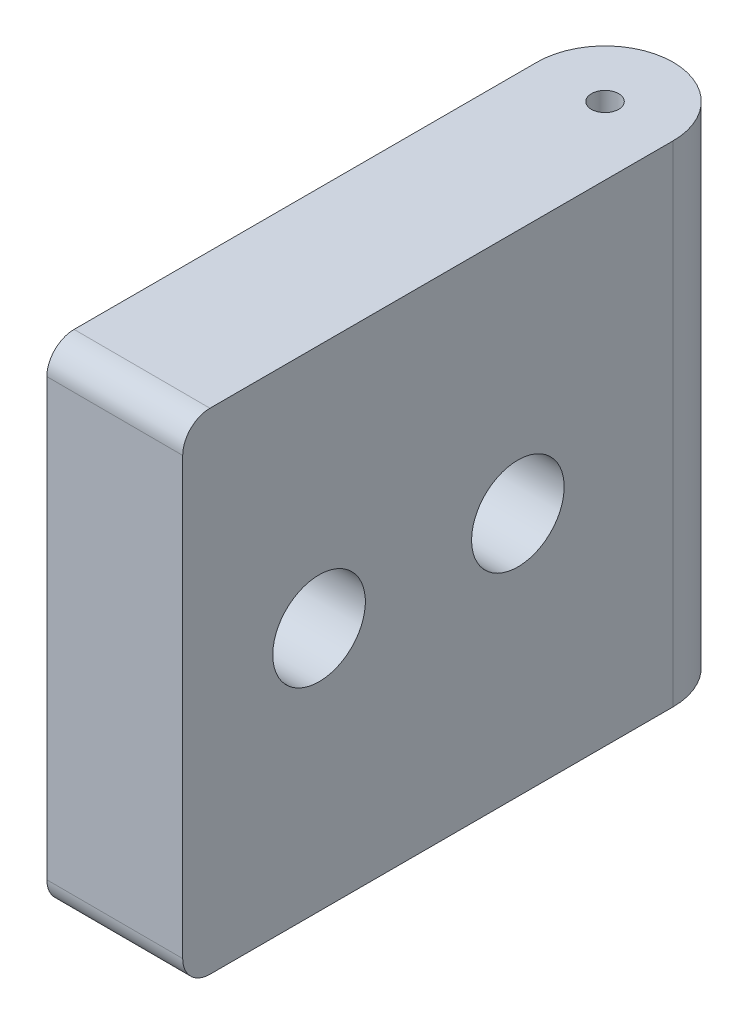
ISO-10303-21;
HEADER;
FILE_DESCRIPTION(('STEP AP214'),'2;1');
FILE_NAME('part.step','',(''),(''),'','','');
FILE_SCHEMA(('AUTOMOTIVE_DESIGN { 1 0 10303 214 1 1 1 1 }'));
ENDSEC;
DATA;
#1=APPLICATION_CONTEXT('core data for automotive mechanical design processes');
#2=APPLICATION_PROTOCOL_DEFINITION('international standard','automotive_design',2000,#1);
#3=PRODUCT_CONTEXT('',#1,'mechanical');
#4=PRODUCT('Part','Part','',(#3));
#5=PRODUCT_RELATED_PRODUCT_CATEGORY('part','',(#4));
#6=PRODUCT_DEFINITION_FORMATION('','',#4);
#7=PRODUCT_DEFINITION_CONTEXT('part definition',#1,'design');
#8=PRODUCT_DEFINITION('design','',#6,#7);
#9=PRODUCT_DEFINITION_SHAPE('','',#8);
#10=(LENGTH_UNIT() NAMED_UNIT(*) SI_UNIT(.MILLI.,.METRE.));
#11=(NAMED_UNIT(*) PLANE_ANGLE_UNIT() SI_UNIT($,.RADIAN.));
#12=(NAMED_UNIT(*) SI_UNIT($,.STERADIAN.) SOLID_ANGLE_UNIT());
#13=UNCERTAINTY_MEASURE_WITH_UNIT(LENGTH_MEASURE(1.E-05),#10,'distance_accuracy_value','');
#14=(GEOMETRIC_REPRESENTATION_CONTEXT(3) GLOBAL_UNCERTAINTY_ASSIGNED_CONTEXT((#13)) GLOBAL_UNIT_ASSIGNED_CONTEXT((#10,
#11,#12)) REPRESENTATION_CONTEXT('',''));
#15=CARTESIAN_POINT('',(0.,0.,0.));
#16=DIRECTION('',(0.,0.,1.));
#17=DIRECTION('',(1.,0.,0.));
#18=AXIS2_PLACEMENT_3D('',#15,#16,#17);
#19=CARTESIAN_POINT('',(0.,18.,0.));
#20=DIRECTION('',(0.,1.,0.));
#21=DIRECTION('',(0.,0.,1.));
#22=AXIS2_PLACEMENT_3D('',#19,#20,#21);
#23=PLANE('',#22);
#24=DIRECTION('',(0.,0.,1.));
#25=VECTOR('',#24,1.);
#26=CARTESIAN_POINT('',(-2.5,18.,17.9940623692888));
#27=LINE('',#26,#25);
#28=CARTESIAN_POINT('',(-2.5,18.,0.));
#29=VERTEX_POINT('',#28);
#30=CARTESIAN_POINT('',(-2.5,18.,16.9940594995695));
#31=VERTEX_POINT('',#30);
#32=EDGE_CURVE('E110',#29,#31,#27,.T.);
#33=ORIENTED_EDGE('',*,*,#32,.T.);
#34=DIRECTION('',(0.999997130288937,0.,0.00239570738840128));
#35=VECTOR('',#34,1.);
#36=CARTESIAN_POINT('',(2.5023957073884,18.,17.0060438103169));
#37=LINE('',#36,#35);
#38=CARTESIAN_POINT('',(2.5,18.,17.0060380708866));
#39=VERTEX_POINT('',#38);
#40=EDGE_CURVE('E11',#31,#39,#37,.T.);
#41=ORIENTED_EDGE('',*,*,#40,.T.);
#42=DIRECTION('',(0.,0.,-1.));
#43=VECTOR('',#42,1.);
#44=CARTESIAN_POINT('',(2.5,18.,18.0060409406059));
#45=LINE('',#44,#43);
#46=CARTESIAN_POINT('',(2.5,18.,0.));
#47=VERTEX_POINT('',#46);
#48=EDGE_CURVE('E88',#39,#47,#45,.T.);
#49=ORIENTED_EDGE('',*,*,#48,.T.);
#50=CARTESIAN_POINT('',(0.,18.,0.));
#51=DIRECTION('',(0.,1.,0.));
#52=DIRECTION('',(0.,0.,1.));
#53=AXIS2_PLACEMENT_3D('',#50,#51,#52);
#54=CIRCLE('',#53,2.5);
#55=EDGE_CURVE('E92',#47,#29,#54,.T.);
#56=ORIENTED_EDGE('',*,*,#55,.T.);
#57=EDGE_LOOP('',(#33,#41,#49,#56));
#58=FACE_BOUND('',#57,.T.);
#59=CARTESIAN_POINT('',(0.,18.,0.));
#60=DIRECTION('',(0.,1.,0.));
#61=DIRECTION('',(0.,0.,1.));
#62=AXIS2_PLACEMENT_3D('',#59,#60,#61);
#63=CIRCLE('',#62,0.5);
#64=CARTESIAN_POINT('',(0.,18.,0.5));
#65=VERTEX_POINT('',#64);
#66=EDGE_CURVE('E118',#65,#65,#63,.T.);
#67=ORIENTED_EDGE('',*,*,#66,.F.);
#68=EDGE_LOOP('',(#67));
#69=FACE_BOUND('',#68,.T.);
#70=ADVANCED_FACE('F32',(#58,#69),#23,.T.);
#71=CARTESIAN_POINT('',(0.,0.,0.));
#72=DIRECTION('',(0.,1.,0.));
#73=DIRECTION('',(0.,0.,1.));
#74=AXIS2_PLACEMENT_3D('',#71,#72,#73);
#75=PLANE('',#74);
#76=DIRECTION('',(0.,0.,-1.));
#77=VECTOR('',#76,1.);
#78=CARTESIAN_POINT('',(2.5,0.,18.0060409406059));
#79=LINE('',#78,#77);
#80=CARTESIAN_POINT('',(2.5,0.,17.0060380708866));
#81=VERTEX_POINT('',#80);
#82=CARTESIAN_POINT('',(2.5,0.,0.));
#83=VERTEX_POINT('',#82);
#84=EDGE_CURVE('E102',#81,#83,#79,.T.);
#85=ORIENTED_EDGE('',*,*,#84,.F.);
#86=DIRECTION('',(0.999997130288937,0.,0.00239570738840128));
#87=VECTOR('',#86,1.);
#88=CARTESIAN_POINT('',(-0.0407270256028218,0.,16.9999512149119));
#89=LINE('',#88,#87);
#90=CARTESIAN_POINT('',(-2.5,0.,16.9940594995695));
#91=VERTEX_POINT('',#90);
#92=EDGE_CURVE('E55',#81,#91,#89,.F.);
#93=ORIENTED_EDGE('',*,*,#92,.T.);
#94=DIRECTION('',(0.,0.,1.));
#95=VECTOR('',#94,1.);
#96=CARTESIAN_POINT('',(-2.5,0.,17.9940623692888));
#97=LINE('',#96,#95);
#98=CARTESIAN_POINT('',(-2.5,0.,0.));
#99=VERTEX_POINT('',#98);
#100=EDGE_CURVE('E96',#99,#91,#97,.T.);
#101=ORIENTED_EDGE('',*,*,#100,.F.);
#102=CARTESIAN_POINT('',(0.,0.,0.));
#103=DIRECTION('',(0.,1.,0.));
#104=DIRECTION('',(0.,0.,1.));
#105=AXIS2_PLACEMENT_3D('',#102,#103,#104);
#106=CIRCLE('',#105,2.5);
#107=EDGE_CURVE('E117',#83,#99,#106,.T.);
#108=ORIENTED_EDGE('',*,*,#107,.F.);
#109=EDGE_LOOP('',(#85,#93,#101,#108));
#110=FACE_BOUND('',#109,.T.);
#111=CARTESIAN_POINT('',(0.,0.,0.));
#112=DIRECTION('',(0.,1.,0.));
#113=DIRECTION('',(0.,0.,1.));
#114=AXIS2_PLACEMENT_3D('',#111,#112,#113);
#115=CIRCLE('',#114,0.5);
#116=CARTESIAN_POINT('',(0.,0.,0.5));
#117=VERTEX_POINT('',#116);
#118=EDGE_CURVE('E265',#117,#117,#115,.T.);
#119=ORIENTED_EDGE('',*,*,#118,.T.);
#120=EDGE_LOOP('',(#119));
#121=FACE_BOUND('',#120,.T.);
#122=ADVANCED_FACE('F144',(#110,#121),#75,.F.);
#123=CARTESIAN_POINT('',(-2.5,18.,17.9940623692888));
#124=DIRECTION('',(0.00239570738840128,0.,-0.999997130288937));
#125=DIRECTION('',(-0.999997130288937,0.,-0.00239570738840128));
#126=AXIS2_PLACEMENT_3D('',#123,#124,#125);
#127=PLANE('',#126);
#128=DIRECTION('',(0.,-1.,0.));
#129=VECTOR('',#128,1.);
#130=CARTESIAN_POINT('',(-2.5,18.,17.9940623692888));
#131=LINE('',#130,#129);
#132=CARTESIAN_POINT('',(-2.5,17.,17.9940623692888));
#133=VERTEX_POINT('',#132);
#134=CARTESIAN_POINT('',(-2.5,1.,17.9940623692888));
#135=VERTEX_POINT('',#134);
#136=EDGE_CURVE('E112',#133,#135,#131,.T.);
#137=ORIENTED_EDGE('',*,*,#136,.T.);
#138=DIRECTION('',(0.999997130288937,0.,0.00239570738840128));
#139=VECTOR('',#138,1.);
#140=CARTESIAN_POINT('',(-2.5,1.,17.9940623692888));
#141=LINE('',#140,#139);
#142=CARTESIAN_POINT('',(2.5,1.,18.0060409406059));
#143=VERTEX_POINT('',#142);
#144=EDGE_CURVE('E127',#135,#143,#141,.T.);
#145=ORIENTED_EDGE('',*,*,#144,.T.);
#146=DIRECTION('',(0.,-1.,0.));
#147=VECTOR('',#146,1.);
#148=CARTESIAN_POINT('',(2.5,18.,18.0060409406059));
#149=LINE('',#148,#147);
#150=CARTESIAN_POINT('',(2.5,17.,18.0060409406059));
#151=VERTEX_POINT('',#150);
#152=EDGE_CURVE('E105',#151,#143,#149,.T.);
#153=ORIENTED_EDGE('',*,*,#152,.F.);
#154=DIRECTION('',(0.999997130288937,0.,0.00239570738840128));
#155=VECTOR('',#154,1.);
#156=CARTESIAN_POINT('',(-2.5,17.,17.9940623692888));
#157=LINE('',#156,#155);
#158=EDGE_CURVE('E125',#151,#133,#157,.F.);
#159=ORIENTED_EDGE('',*,*,#158,.T.);
#160=EDGE_LOOP('',(#137,#145,#153,#159));
#161=FACE_BOUND('',#160,.T.);
#162=ADVANCED_FACE('F140',(#161),#127,.F.);
#163=CARTESIAN_POINT('',(2.5,18.,18.0060409406059));
#164=DIRECTION('',(-1.,0.,0.));
#165=DIRECTION('',(0.,0.,1.));
#166=AXIS2_PLACEMENT_3D('',#163,#164,#165);
#167=PLANE('',#166);
#168=CARTESIAN_POINT('',(2.5,9.,5.7));
#169=DIRECTION('',(-1.,0.,0.));
#170=DIRECTION('',(0.,0.,1.));
#171=AXIS2_PLACEMENT_3D('',#168,#169,#170);
#172=CIRCLE('',#171,1.7);
#173=CARTESIAN_POINT('',(2.5,9.,7.4));
#174=VERTEX_POINT('',#173);
#175=EDGE_CURVE('E251',#174,#174,#172,.T.);
#176=ORIENTED_EDGE('',*,*,#175,.T.);
#177=EDGE_LOOP('',(#176));
#178=FACE_BOUND('',#177,.T.);
#179=CARTESIAN_POINT('',(2.5,9.,13.));
#180=DIRECTION('',(-1.,0.,0.));
#181=DIRECTION('',(0.,0.,1.));
#182=AXIS2_PLACEMENT_3D('',#179,#180,#181);
#183=CIRCLE('',#182,1.7);
#184=CARTESIAN_POINT('',(2.5,9.,14.7));
#185=VERTEX_POINT('',#184);
#186=EDGE_CURVE('E262',#185,#185,#183,.T.);
#187=ORIENTED_EDGE('',*,*,#186,.T.);
#188=EDGE_LOOP('',(#187));
#189=FACE_BOUND('',#188,.T.);
#190=ORIENTED_EDGE('',*,*,#152,.T.);
#191=CARTESIAN_POINT('',(2.5,1.,17.0060380708866));
#192=DIRECTION('',(-1.,0.,0.));
#193=DIRECTION('',(0.,0.,1.));
#194=AXIS2_PLACEMENT_3D('',#191,#192,#193);
#195=ELLIPSE('',#194,1.0000028697193,1.);
#196=EDGE_CURVE('E132',#143,#81,#195,.F.);
#197=ORIENTED_EDGE('',*,*,#196,.T.);
#198=ORIENTED_EDGE('',*,*,#84,.T.);
#199=DIRECTION('',(0.,-1.,0.));
#200=VECTOR('',#199,1.);
#201=CARTESIAN_POINT('',(2.5,18.,0.));
#202=LINE('',#201,#200);
#203=EDGE_CURVE('E99',#47,#83,#202,.T.);
#204=ORIENTED_EDGE('',*,*,#203,.F.);
#205=ORIENTED_EDGE('',*,*,#48,.F.);
#206=CARTESIAN_POINT('',(2.5,17.,17.0060380708866));
#207=DIRECTION('',(-1.,0.,0.));
#208=DIRECTION('',(0.,0.,-1.));
#209=AXIS2_PLACEMENT_3D('',#206,#207,#208);
#210=ELLIPSE('',#209,1.0000028697193,1.);
#211=EDGE_CURVE('E130',#39,#151,#210,.F.);
#212=ORIENTED_EDGE('',*,*,#211,.T.);
#213=EDGE_LOOP('',(#190,#197,#198,#204,#205,#212));
#214=FACE_BOUND('',#213,.T.);
#215=ADVANCED_FACE('F101',(#178,#189,#214),#167,.F.);
#216=CARTESIAN_POINT('',(0.,18.,0.));
#217=DIRECTION('',(0.,-1.,0.));
#218=DIRECTION('',(0.,0.,-1.));
#219=AXIS2_PLACEMENT_3D('',#216,#217,#218);
#220=CYLINDRICAL_SURFACE('',#219,2.5);
#221=ORIENTED_EDGE('',*,*,#107,.T.);
#222=DIRECTION('',(0.,-1.,0.));
#223=VECTOR('',#222,1.);
#224=CARTESIAN_POINT('',(-2.5,18.,0.));
#225=LINE('',#224,#223);
#226=EDGE_CURVE('E106',#29,#99,#225,.T.);
#227=ORIENTED_EDGE('',*,*,#226,.F.);
#228=ORIENTED_EDGE('',*,*,#55,.F.);
#229=ORIENTED_EDGE('',*,*,#203,.T.);
#230=EDGE_LOOP('',(#221,#227,#228,#229));
#231=FACE_BOUND('',#230,.T.);
#232=ADVANCED_FACE('F108',(#231),#220,.T.);
#233=CARTESIAN_POINT('',(-2.5,18.,17.9940623692888));
#234=DIRECTION('',(1.,0.,0.));
#235=DIRECTION('',(0.,0.,-1.));
#236=AXIS2_PLACEMENT_3D('',#233,#234,#235);
#237=PLANE('',#236);
#238=CARTESIAN_POINT('',(-2.5,9.,5.7));
#239=DIRECTION('',(-1.,0.,0.));
#240=DIRECTION('',(0.,0.,1.));
#241=AXIS2_PLACEMENT_3D('',#238,#239,#240);
#242=CIRCLE('',#241,3.15);
#243=CARTESIAN_POINT('',(-2.5,9.,8.85));
#244=VERTEX_POINT('',#243);
#245=EDGE_CURVE('E249',#244,#244,#242,.T.);
#246=ORIENTED_EDGE('',*,*,#245,.F.);
#247=EDGE_LOOP('',(#246));
#248=FACE_BOUND('',#247,.T.);
#249=CARTESIAN_POINT('',(-2.5,9.,13.));
#250=DIRECTION('',(-1.,0.,0.));
#251=DIRECTION('',(0.,0.,1.));
#252=AXIS2_PLACEMENT_3D('',#249,#250,#251);
#253=CIRCLE('',#252,3.15);
#254=CARTESIAN_POINT('',(-2.5,9.,16.15));
#255=VERTEX_POINT('',#254);
#256=EDGE_CURVE('E256',#255,#255,#253,.T.);
#257=ORIENTED_EDGE('',*,*,#256,.F.);
#258=EDGE_LOOP('',(#257));
#259=FACE_BOUND('',#258,.T.);
#260=ORIENTED_EDGE('',*,*,#100,.T.);
#261=CARTESIAN_POINT('',(-2.5,1.,16.9940594995695));
#262=DIRECTION('',(1.,0.,0.));
#263=DIRECTION('',(0.,0.,1.));
#264=AXIS2_PLACEMENT_3D('',#261,#262,#263);
#265=ELLIPSE('',#264,1.0000028697193,1.);
#266=EDGE_CURVE('E40',#91,#135,#265,.F.);
#267=ORIENTED_EDGE('',*,*,#266,.T.);
#268=ORIENTED_EDGE('',*,*,#136,.F.);
#269=CARTESIAN_POINT('',(-2.5,17.,16.9940594995695));
#270=DIRECTION('',(1.,0.,0.));
#271=DIRECTION('',(0.,0.,-1.));
#272=AXIS2_PLACEMENT_3D('',#269,#270,#271);
#273=ELLIPSE('',#272,1.0000028697193,1.);
#274=EDGE_CURVE('E47',#133,#31,#273,.F.);
#275=ORIENTED_EDGE('',*,*,#274,.T.);
#276=ORIENTED_EDGE('',*,*,#32,.F.);
#277=ORIENTED_EDGE('',*,*,#226,.T.);
#278=EDGE_LOOP('',(#260,#267,#268,#275,#276,#277));
#279=FACE_BOUND('',#278,.T.);
#280=ADVANCED_FACE('F136',(#248,#259,#279),#237,.F.);
#281=CARTESIAN_POINT('',(0.,18.,0.));
#282=DIRECTION('',(0.,-1.,0.));
#283=DIRECTION('',(0.,0.,-1.));
#284=AXIS2_PLACEMENT_3D('',#281,#282,#283);
#285=CYLINDRICAL_SURFACE('',#284,0.5);
#286=ORIENTED_EDGE('',*,*,#66,.T.);
#287=EDGE_LOOP('',(#286));
#288=FACE_BOUND('',#287,.T.);
#289=ORIENTED_EDGE('',*,*,#118,.F.);
#290=EDGE_LOOP('',(#289));
#291=FACE_BOUND('',#290,.T.);
#292=ADVANCED_FACE('F156',(#288,#291),#285,.F.);
#293=CARTESIAN_POINT('',(-2.4976042926116,1.,16.9940652389999));
#294=DIRECTION('',(0.999997130288937,0.,0.00239570738840128));
#295=DIRECTION('',(0.00239570738840128,0.,-0.999997130288937));
#296=AXIS2_PLACEMENT_3D('',#293,#294,#295);
#297=CYLINDRICAL_SURFACE('',#296,1.);
#298=ORIENTED_EDGE('',*,*,#266,.F.);
#299=ORIENTED_EDGE('',*,*,#92,.F.);
#300=ORIENTED_EDGE('',*,*,#196,.F.);
#301=ORIENTED_EDGE('',*,*,#144,.F.);
#302=EDGE_LOOP('',(#298,#299,#300,#301));
#303=FACE_BOUND('',#302,.T.);
#304=ADVANCED_FACE('F143',(#303),#297,.T.);
#305=CARTESIAN_POINT('',(-0.0407270256028218,17.,16.9999512149119));
#306=DIRECTION('',(-0.999997130288937,0.,-0.00239570738840128));
#307=DIRECTION('',(-0.00239570738840128,0.,0.999997130288937));
#308=AXIS2_PLACEMENT_3D('',#305,#306,#307);
#309=CYLINDRICAL_SURFACE('',#308,1.);
#310=ORIENTED_EDGE('',*,*,#274,.F.);
#311=ORIENTED_EDGE('',*,*,#158,.F.);
#312=ORIENTED_EDGE('',*,*,#211,.F.);
#313=ORIENTED_EDGE('',*,*,#40,.F.);
#314=EDGE_LOOP('',(#310,#311,#312,#313));
#315=FACE_BOUND('',#314,.T.);
#316=ADVANCED_FACE('F34',(#315),#309,.T.);
#317=CARTESIAN_POINT('',(-2.5,9.,13.));
#318=DIRECTION('',(-1.,0.,0.));
#319=DIRECTION('',(0.,0.,1.));
#320=AXIS2_PLACEMENT_3D('',#317,#318,#319);
#321=CYLINDRICAL_SURFACE('',#320,1.69999999999999);
#322=ORIENTED_EDGE('',*,*,#186,.F.);
#323=EDGE_LOOP('',(#322));
#324=FACE_BOUND('',#323,.T.);
#325=CARTESIAN_POINT('',(-1.04999999999999,9.,13.));
#326=DIRECTION('',(-1.,0.,0.));
#327=DIRECTION('',(0.,0.,1.));
#328=AXIS2_PLACEMENT_3D('',#325,#326,#327);
#329=CIRCLE('',#328,1.69999999999999);
#330=CARTESIAN_POINT('',(-1.04999999999999,9.,14.7));
#331=VERTEX_POINT('',#330);
#332=EDGE_CURVE('E259',#331,#331,#329,.T.);
#333=ORIENTED_EDGE('',*,*,#332,.T.);
#334=EDGE_LOOP('',(#333));
#335=FACE_BOUND('',#334,.T.);
#336=ADVANCED_FACE('F148',(#324,#335),#321,.F.);
#337=CARTESIAN_POINT('',(-2.5,9.,13.));
#338=DIRECTION('',(-1.,0.,0.));
#339=DIRECTION('',(0.,0.,1.));
#340=AXIS2_PLACEMENT_3D('',#337,#338,#339);
#341=CONICAL_SURFACE('',#340,3.15,0.78539816339745);
#342=ORIENTED_EDGE('',*,*,#332,.F.);
#343=EDGE_LOOP('',(#342));
#344=FACE_BOUND('',#343,.T.);
#345=ORIENTED_EDGE('',*,*,#256,.T.);
#346=EDGE_LOOP('',(#345));
#347=FACE_BOUND('',#346,.T.);
#348=ADVANCED_FACE('F153',(#344,#347),#341,.F.);
#349=CARTESIAN_POINT('',(-2.5,9.,5.7));
#350=DIRECTION('',(-1.,0.,0.));
#351=DIRECTION('',(0.,0.,1.));
#352=AXIS2_PLACEMENT_3D('',#349,#350,#351);
#353=CYLINDRICAL_SURFACE('',#352,1.69999999999999);
#354=ORIENTED_EDGE('',*,*,#175,.F.);
#355=EDGE_LOOP('',(#354));
#356=FACE_BOUND('',#355,.T.);
#357=CARTESIAN_POINT('',(-1.04999999999999,9.,5.7));
#358=DIRECTION('',(-1.,0.,0.));
#359=DIRECTION('',(0.,0.,1.));
#360=AXIS2_PLACEMENT_3D('',#357,#358,#359);
#361=CIRCLE('',#360,1.69999999999999);
#362=CARTESIAN_POINT('',(-1.04999999999999,9.,7.39999999999999));
#363=VERTEX_POINT('',#362);
#364=EDGE_CURVE('E246',#363,#363,#361,.T.);
#365=ORIENTED_EDGE('',*,*,#364,.T.);
#366=EDGE_LOOP('',(#365));
#367=FACE_BOUND('',#366,.T.);
#368=ADVANCED_FACE('F219',(#356,#367),#353,.F.);
#369=CARTESIAN_POINT('',(-2.5,9.,5.7));
#370=DIRECTION('',(-1.,0.,0.));
#371=DIRECTION('',(0.,0.,1.));
#372=AXIS2_PLACEMENT_3D('',#369,#370,#371);
#373=CONICAL_SURFACE('',#372,3.15,0.78539816339745);
#374=ORIENTED_EDGE('',*,*,#364,.F.);
#375=EDGE_LOOP('',(#374));
#376=FACE_BOUND('',#375,.T.);
#377=ORIENTED_EDGE('',*,*,#245,.T.);
#378=EDGE_LOOP('',(#377));
#379=FACE_BOUND('',#378,.T.);
#380=ADVANCED_FACE('F228',(#376,#379),#373,.F.);
#381=CLOSED_SHELL('',(#70,#122,#162,#215,#232,#280,#292,#304,#316,#336,#348,#368,#380));
#382=MANIFOLD_SOLID_BREP('B2',#381);
#383=ADVANCED_BREP_SHAPE_REPRESENTATION('',(#18,#382),#14);
#384=SHAPE_DEFINITION_REPRESENTATION(#9,#383);
ENDSEC;
END-ISO-10303-21;
